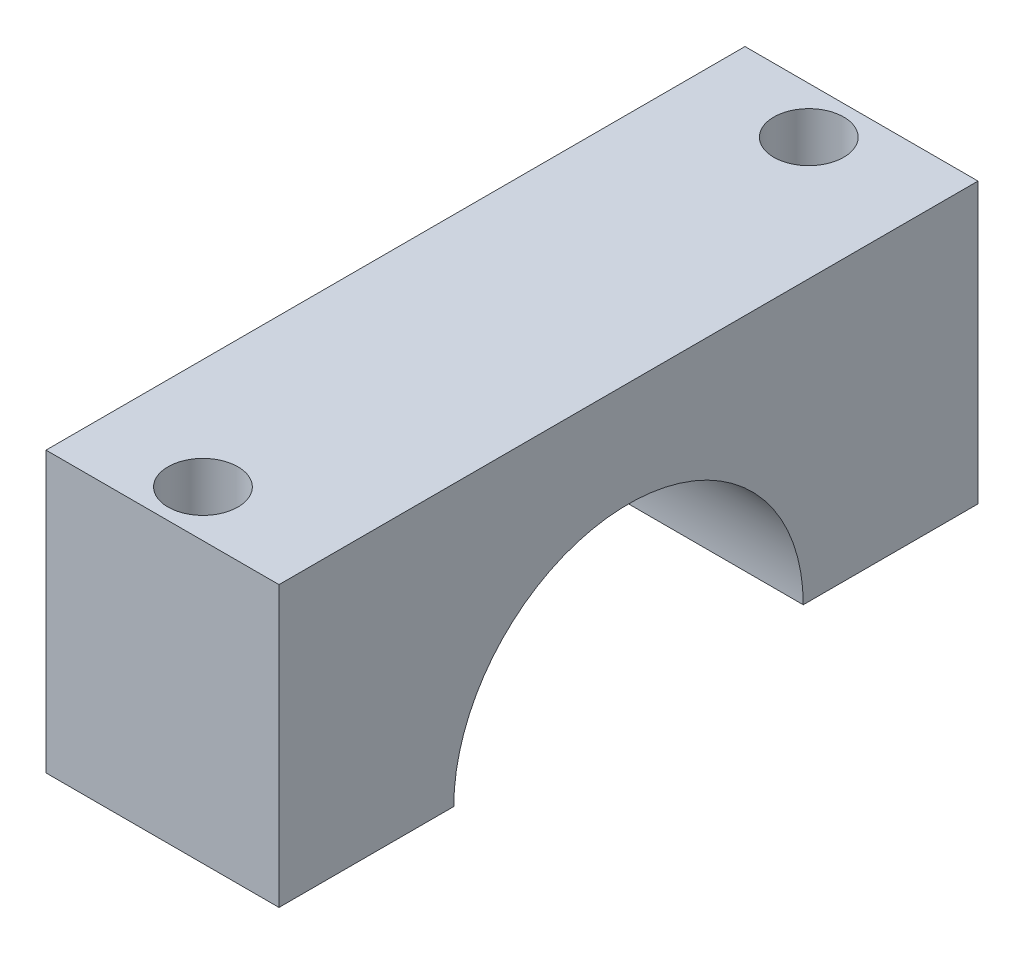
ISO-10303-21;
HEADER;
FILE_DESCRIPTION(('STEP AP214'),'2;1');
FILE_NAME('part.step','',(''),(''),'','','');
FILE_SCHEMA(('AUTOMOTIVE_DESIGN { 1 0 10303 214 1 1 1 1 }'));
ENDSEC;
DATA;
#1=APPLICATION_CONTEXT('core data for automotive mechanical design processes');
#2=APPLICATION_PROTOCOL_DEFINITION('international standard','automotive_design',2000,#1);
#3=PRODUCT_CONTEXT('',#1,'mechanical');
#4=PRODUCT('Part','Part','',(#3));
#5=PRODUCT_RELATED_PRODUCT_CATEGORY('part','',(#4));
#6=PRODUCT_DEFINITION_FORMATION('','',#4);
#7=PRODUCT_DEFINITION_CONTEXT('part definition',#1,'design');
#8=PRODUCT_DEFINITION('design','',#6,#7);
#9=PRODUCT_DEFINITION_SHAPE('','',#8);
#10=(LENGTH_UNIT() NAMED_UNIT(*) SI_UNIT(.MILLI.,.METRE.));
#11=(NAMED_UNIT(*) PLANE_ANGLE_UNIT() SI_UNIT($,.RADIAN.));
#12=(NAMED_UNIT(*) SI_UNIT($,.STERADIAN.) SOLID_ANGLE_UNIT());
#13=UNCERTAINTY_MEASURE_WITH_UNIT(LENGTH_MEASURE(1.E-05),#10,'distance_accuracy_value','');
#14=(GEOMETRIC_REPRESENTATION_CONTEXT(3) GLOBAL_UNCERTAINTY_ASSIGNED_CONTEXT((#13)) GLOBAL_UNIT_ASSIGNED_CONTEXT((#10,
#11,#12)) REPRESENTATION_CONTEXT('',''));
#15=CARTESIAN_POINT('',(0.,0.,0.));
#16=DIRECTION('',(0.,0.,1.));
#17=DIRECTION('',(1.,0.,0.));
#18=AXIS2_PLACEMENT_3D('',#15,#16,#17);
#19=CARTESIAN_POINT('',(-20.,0.,0.));
#20=DIRECTION('',(0.,-1.,0.));
#21=DIRECTION('',(0.,0.,-1.));
#22=AXIS2_PLACEMENT_3D('',#19,#20,#21);
#23=PLANE('',#22);
#24=CARTESIAN_POINT('',(-10.5270623932868,0.,26.));
#25=DIRECTION('',(0.,1.,0.));
#26=DIRECTION('',(0.,0.,1.));
#27=AXIS2_PLACEMENT_3D('',#24,#25,#26);
#28=CIRCLE('',#27,3.);
#29=CARTESIAN_POINT('',(-10.5270623932868,0.,29.));
#30=VERTEX_POINT('',#29);
#31=EDGE_CURVE('E199',#30,#30,#28,.T.);
#32=ORIENTED_EDGE('',*,*,#31,.T.);
#33=EDGE_LOOP('',(#32));
#34=FACE_BOUND('',#33,.T.);
#35=DIRECTION('',(-1.,0.,0.));
#36=VECTOR('',#35,1.);
#37=CARTESIAN_POINT('',(0.,0.,15.));
#38=LINE('',#37,#36);
#39=CARTESIAN_POINT('',(0.,0.,15.));
#40=VERTEX_POINT('',#39);
#41=CARTESIAN_POINT('',(-20.,0.,15.));
#42=VERTEX_POINT('',#41);
#43=EDGE_CURVE('E107',#40,#42,#38,.T.);
#44=ORIENTED_EDGE('',*,*,#43,.F.);
#45=DIRECTION('',(0.,0.,-1.));
#46=VECTOR('',#45,1.);
#47=CARTESIAN_POINT('',(0.,0.,0.));
#48=LINE('',#47,#46);
#49=CARTESIAN_POINT('',(0.,0.,30.));
#50=VERTEX_POINT('',#49);
#51=EDGE_CURVE('E116',#50,#40,#48,.T.);
#52=ORIENTED_EDGE('',*,*,#51,.F.);
#53=DIRECTION('',(1.,0.,0.));
#54=VECTOR('',#53,1.);
#55=CARTESIAN_POINT('',(-20.,0.,30.));
#56=LINE('',#55,#54);
#57=CARTESIAN_POINT('',(-20.,0.,30.));
#58=VERTEX_POINT('',#57);
#59=EDGE_CURVE('E11',#58,#50,#56,.T.);
#60=ORIENTED_EDGE('',*,*,#59,.F.);
#61=DIRECTION('',(0.,0.,-1.));
#62=VECTOR('',#61,1.);
#63=CARTESIAN_POINT('',(-20.,0.,-30.));
#64=LINE('',#63,#62);
#65=EDGE_CURVE('E68',#58,#42,#64,.T.);
#66=ORIENTED_EDGE('',*,*,#65,.T.);
#67=EDGE_LOOP('',(#44,#52,#60,#66));
#68=FACE_BOUND('',#67,.T.);
#69=ADVANCED_FACE('F41',(#34,#68),#23,.T.);
#70=CARTESIAN_POINT('',(-10.5270623932868,0.,-26.));
#71=DIRECTION('',(0.,1.,0.));
#72=DIRECTION('',(0.,0.,1.));
#73=AXIS2_PLACEMENT_3D('',#70,#71,#72);
#74=CIRCLE('',#73,3.);
#75=CARTESIAN_POINT('',(-10.5270623932868,0.,-23.));
#76=VERTEX_POINT('',#75);
#77=EDGE_CURVE('E194',#76,#76,#74,.T.);
#78=ORIENTED_EDGE('',*,*,#77,.T.);
#79=EDGE_LOOP('',(#78));
#80=FACE_BOUND('',#79,.T.);
#81=DIRECTION('',(-1.,0.,0.));
#82=VECTOR('',#81,1.);
#83=CARTESIAN_POINT('',(0.,0.,-15.));
#84=LINE('',#83,#82);
#85=CARTESIAN_POINT('',(-20.,0.,-15.));
#86=VERTEX_POINT('',#85);
#87=CARTESIAN_POINT('',(0.,0.,-15.));
#88=VERTEX_POINT('',#87);
#89=EDGE_CURVE('E59',#86,#88,#84,.F.);
#90=ORIENTED_EDGE('',*,*,#89,.F.);
#91=CARTESIAN_POINT('',(-20.,0.,-30.));
#92=VERTEX_POINT('',#91);
#93=EDGE_CURVE('E95',#86,#92,#64,.T.);
#94=ORIENTED_EDGE('',*,*,#93,.T.);
#95=DIRECTION('',(1.,0.,0.));
#96=VECTOR('',#95,1.);
#97=CARTESIAN_POINT('',(-20.,0.,-30.));
#98=LINE('',#97,#96);
#99=CARTESIAN_POINT('',(0.,0.,-30.));
#100=VERTEX_POINT('',#99);
#101=EDGE_CURVE('E45',#92,#100,#98,.T.);
#102=ORIENTED_EDGE('',*,*,#101,.T.);
#103=EDGE_CURVE('E124',#88,#100,#48,.T.);
#104=ORIENTED_EDGE('',*,*,#103,.F.);
#105=EDGE_LOOP('',(#90,#94,#102,#104));
#106=FACE_BOUND('',#105,.T.);
#107=ADVANCED_FACE('F160',(#80,#106),#23,.T.);
#108=CARTESIAN_POINT('',(-20.,0.,30.));
#109=DIRECTION('',(0.,0.,1.));
#110=DIRECTION('',(1.,0.,0.));
#111=AXIS2_PLACEMENT_3D('',#108,#109,#110);
#112=PLANE('',#111);
#113=DIRECTION('',(0.,-1.,0.));
#114=VECTOR('',#113,1.);
#115=CARTESIAN_POINT('',(0.,0.,30.));
#116=LINE('',#115,#114);
#117=CARTESIAN_POINT('',(0.,24.,30.));
#118=VERTEX_POINT('',#117);
#119=EDGE_CURVE('E122',#118,#50,#116,.T.);
#120=ORIENTED_EDGE('',*,*,#119,.F.);
#121=DIRECTION('',(1.,0.,0.));
#122=VECTOR('',#121,1.);
#123=CARTESIAN_POINT('',(-20.,24.,30.));
#124=LINE('',#123,#122);
#125=CARTESIAN_POINT('',(-20.,24.,30.));
#126=VERTEX_POINT('',#125);
#127=EDGE_CURVE('E51',#126,#118,#124,.T.);
#128=ORIENTED_EDGE('',*,*,#127,.F.);
#129=DIRECTION('',(0.,-1.,0.));
#130=VECTOR('',#129,1.);
#131=CARTESIAN_POINT('',(-20.,0.,30.));
#132=LINE('',#131,#130);
#133=EDGE_CURVE('E140',#126,#58,#132,.T.);
#134=ORIENTED_EDGE('',*,*,#133,.T.);
#135=ORIENTED_EDGE('',*,*,#59,.T.);
#136=EDGE_LOOP('',(#120,#128,#134,#135));
#137=FACE_BOUND('',#136,.T.);
#138=ADVANCED_FACE('F158',(#137),#112,.T.);
#139=CARTESIAN_POINT('',(-20.,24.,30.));
#140=DIRECTION('',(0.,1.,0.));
#141=DIRECTION('',(0.,0.,1.));
#142=AXIS2_PLACEMENT_3D('',#139,#140,#141);
#143=PLANE('',#142);
#144=CARTESIAN_POINT('',(-10.5270623932868,24.,-26.));
#145=DIRECTION('',(0.,1.,0.));
#146=DIRECTION('',(0.,0.,1.));
#147=AXIS2_PLACEMENT_3D('',#144,#145,#146);
#148=CIRCLE('',#147,3.);
#149=CARTESIAN_POINT('',(-10.5270623932868,24.,-23.));
#150=VERTEX_POINT('',#149);
#151=EDGE_CURVE('E197',#150,#150,#148,.T.);
#152=ORIENTED_EDGE('',*,*,#151,.F.);
#153=EDGE_LOOP('',(#152));
#154=FACE_BOUND('',#153,.T.);
#155=CARTESIAN_POINT('',(-10.5270623932868,24.,26.));
#156=DIRECTION('',(0.,1.,0.));
#157=DIRECTION('',(0.,0.,1.));
#158=AXIS2_PLACEMENT_3D('',#155,#156,#157);
#159=CIRCLE('',#158,3.);
#160=CARTESIAN_POINT('',(-10.5270623932868,24.,29.));
#161=VERTEX_POINT('',#160);
#162=EDGE_CURVE('E204',#161,#161,#159,.T.);
#163=ORIENTED_EDGE('',*,*,#162,.F.);
#164=EDGE_LOOP('',(#163));
#165=FACE_BOUND('',#164,.T.);
#166=DIRECTION('',(0.,0.,1.));
#167=VECTOR('',#166,1.);
#168=CARTESIAN_POINT('',(0.,24.,30.));
#169=LINE('',#168,#167);
#170=CARTESIAN_POINT('',(0.,24.,-30.));
#171=VERTEX_POINT('',#170);
#172=EDGE_CURVE('E152',#171,#118,#169,.T.);
#173=ORIENTED_EDGE('',*,*,#172,.F.);
#174=DIRECTION('',(1.,0.,0.));
#175=VECTOR('',#174,1.);
#176=CARTESIAN_POINT('',(-20.,24.,-30.));
#177=LINE('',#176,#175);
#178=CARTESIAN_POINT('',(-20.,24.,-30.));
#179=VERTEX_POINT('',#178);
#180=EDGE_CURVE('E133',#179,#171,#177,.T.);
#181=ORIENTED_EDGE('',*,*,#180,.F.);
#182=DIRECTION('',(0.,0.,1.));
#183=VECTOR('',#182,1.);
#184=CARTESIAN_POINT('',(-20.,24.,30.));
#185=LINE('',#184,#183);
#186=EDGE_CURVE('E142',#179,#126,#185,.T.);
#187=ORIENTED_EDGE('',*,*,#186,.T.);
#188=ORIENTED_EDGE('',*,*,#127,.T.);
#189=EDGE_LOOP('',(#173,#181,#187,#188));
#190=FACE_BOUND('',#189,.T.);
#191=ADVANCED_FACE('F156',(#154,#165,#190),#143,.T.);
#192=CARTESIAN_POINT('',(-20.,24.,-30.));
#193=DIRECTION('',(0.,0.,-1.));
#194=DIRECTION('',(0.,1.,0.));
#195=AXIS2_PLACEMENT_3D('',#192,#193,#194);
#196=PLANE('',#195);
#197=DIRECTION('',(0.,1.,0.));
#198=VECTOR('',#197,1.);
#199=CARTESIAN_POINT('',(0.,24.,-30.));
#200=LINE('',#199,#198);
#201=EDGE_CURVE('E118',#100,#171,#200,.T.);
#202=ORIENTED_EDGE('',*,*,#201,.F.);
#203=ORIENTED_EDGE('',*,*,#101,.F.);
#204=DIRECTION('',(0.,1.,0.));
#205=VECTOR('',#204,1.);
#206=CARTESIAN_POINT('',(-20.,24.,-30.));
#207=LINE('',#206,#205);
#208=EDGE_CURVE('E146',#92,#179,#207,.T.);
#209=ORIENTED_EDGE('',*,*,#208,.T.);
#210=ORIENTED_EDGE('',*,*,#180,.T.);
#211=EDGE_LOOP('',(#202,#203,#209,#210));
#212=FACE_BOUND('',#211,.T.);
#213=ADVANCED_FACE('F43',(#212),#196,.T.);
#214=CARTESIAN_POINT('',(-20.,0.,0.));
#215=DIRECTION('',(-1.,0.,0.));
#216=DIRECTION('',(0.,0.,1.));
#217=AXIS2_PLACEMENT_3D('',#214,#215,#216);
#218=PLANE('',#217);
#219=CARTESIAN_POINT('',(-20.,0.,0.));
#220=DIRECTION('',(-1.,0.,0.));
#221=DIRECTION('',(0.,0.,1.));
#222=AXIS2_PLACEMENT_3D('',#219,#220,#221);
#223=CIRCLE('',#222,15.);
#224=EDGE_CURVE('E112',#42,#86,#223,.T.);
#225=ORIENTED_EDGE('',*,*,#224,.F.);
#226=ORIENTED_EDGE('',*,*,#65,.F.);
#227=ORIENTED_EDGE('',*,*,#133,.F.);
#228=ORIENTED_EDGE('',*,*,#186,.F.);
#229=ORIENTED_EDGE('',*,*,#208,.F.);
#230=ORIENTED_EDGE('',*,*,#93,.F.);
#231=EDGE_LOOP('',(#225,#226,#227,#228,#229,#230));
#232=FACE_BOUND('',#231,.T.);
#233=ADVANCED_FACE('F177',(#232),#218,.T.);
#234=CARTESIAN_POINT('',(0.,0.,0.));
#235=DIRECTION('',(-1.,0.,0.));
#236=DIRECTION('',(0.,0.,1.));
#237=AXIS2_PLACEMENT_3D('',#234,#235,#236);
#238=PLANE('',#237);
#239=ORIENTED_EDGE('',*,*,#51,.T.);
#240=CARTESIAN_POINT('',(0.,0.,0.));
#241=DIRECTION('',(-1.,0.,0.));
#242=DIRECTION('',(0.,0.,1.));
#243=AXIS2_PLACEMENT_3D('',#240,#241,#242);
#244=CIRCLE('',#243,15.);
#245=EDGE_CURVE('E104',#40,#88,#244,.T.);
#246=ORIENTED_EDGE('',*,*,#245,.T.);
#247=ORIENTED_EDGE('',*,*,#103,.T.);
#248=ORIENTED_EDGE('',*,*,#201,.T.);
#249=ORIENTED_EDGE('',*,*,#172,.T.);
#250=ORIENTED_EDGE('',*,*,#119,.T.);
#251=EDGE_LOOP('',(#239,#246,#247,#248,#249,#250));
#252=FACE_BOUND('',#251,.T.);
#253=ADVANCED_FACE('F120',(#252),#238,.F.);
#254=CARTESIAN_POINT('',(0.,0.,0.));
#255=DIRECTION('',(-1.,0.,0.));
#256=DIRECTION('',(0.,0.,1.));
#257=AXIS2_PLACEMENT_3D('',#254,#255,#256);
#258=CYLINDRICAL_SURFACE('',#257,15.);
#259=ORIENTED_EDGE('',*,*,#43,.T.);
#260=ORIENTED_EDGE('',*,*,#224,.T.);
#261=ORIENTED_EDGE('',*,*,#89,.T.);
#262=ORIENTED_EDGE('',*,*,#245,.F.);
#263=EDGE_LOOP('',(#259,#260,#261,#262));
#264=FACE_BOUND('',#263,.T.);
#265=ADVANCED_FACE('F106',(#264),#258,.F.);
#266=CARTESIAN_POINT('',(-10.5270623932868,0.,26.));
#267=DIRECTION('',(0.,1.,0.));
#268=DIRECTION('',(0.,0.,1.));
#269=AXIS2_PLACEMENT_3D('',#266,#267,#268);
#270=CYLINDRICAL_SURFACE('',#269,3.);
#271=ORIENTED_EDGE('',*,*,#31,.F.);
#272=EDGE_LOOP('',(#271));
#273=FACE_BOUND('',#272,.T.);
#274=ORIENTED_EDGE('',*,*,#162,.T.);
#275=EDGE_LOOP('',(#274));
#276=FACE_BOUND('',#275,.T.);
#277=ADVANCED_FACE('F182',(#273,#276),#270,.F.);
#278=CARTESIAN_POINT('',(-10.5270623932868,0.,-26.));
#279=DIRECTION('',(0.,1.,0.));
#280=DIRECTION('',(0.,0.,1.));
#281=AXIS2_PLACEMENT_3D('',#278,#279,#280);
#282=CYLINDRICAL_SURFACE('',#281,3.);
#283=ORIENTED_EDGE('',*,*,#77,.F.);
#284=EDGE_LOOP('',(#283));
#285=FACE_BOUND('',#284,.T.);
#286=ORIENTED_EDGE('',*,*,#151,.T.);
#287=EDGE_LOOP('',(#286));
#288=FACE_BOUND('',#287,.T.);
#289=ADVANCED_FACE('F185',(#285,#288),#282,.F.);
#290=CLOSED_SHELL('',(#69,#107,#138,#191,#213,#233,#253,#265,#277,#289));
#291=MANIFOLD_SOLID_BREP('B2',#290);
#292=ADVANCED_BREP_SHAPE_REPRESENTATION('',(#18,#291),#14);
#293=SHAPE_DEFINITION_REPRESENTATION(#9,#292);
ENDSEC;
END-ISO-10303-21;
